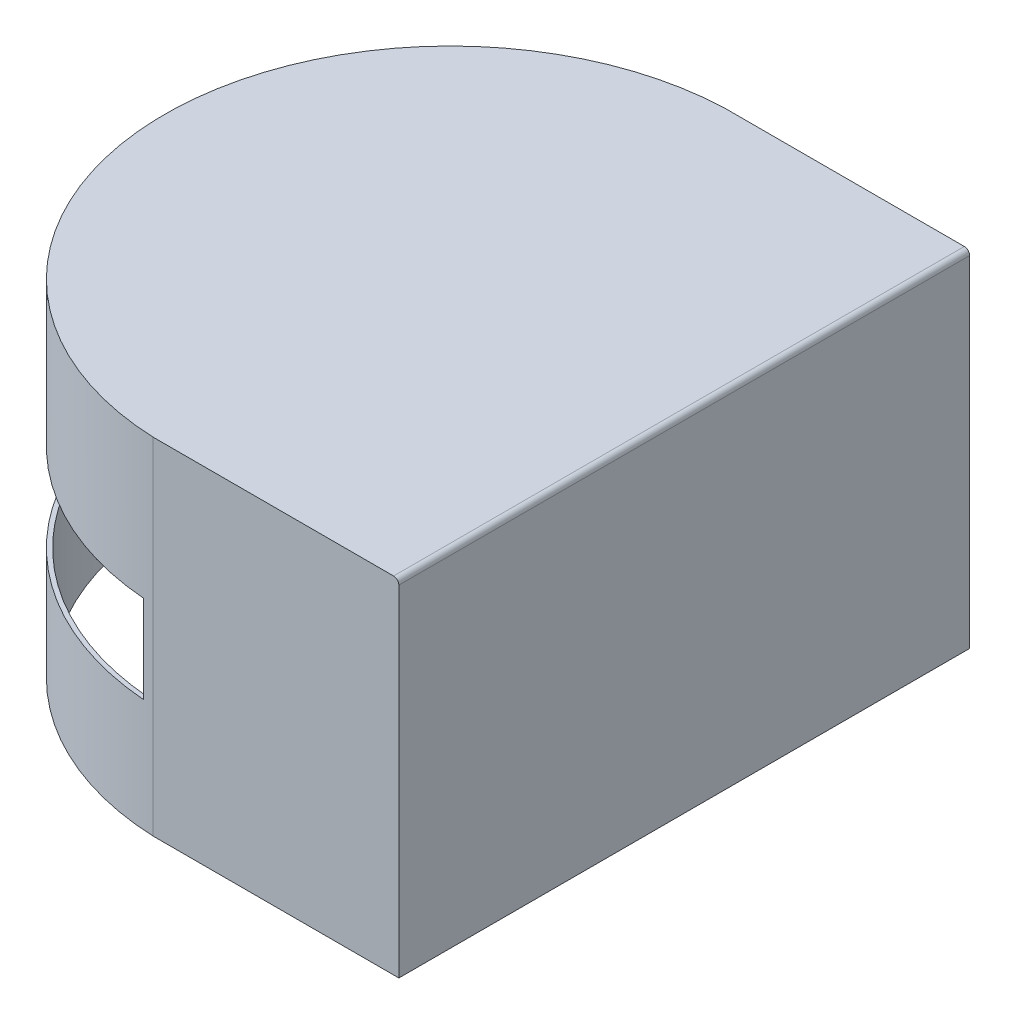
ISO-10303-21;
HEADER;
FILE_DESCRIPTION(('STEP AP214'),'2;1');
FILE_NAME('part.step','',(''),(''),'','','');
FILE_SCHEMA(('AUTOMOTIVE_DESIGN { 1 0 10303 214 1 1 1 1 }'));
ENDSEC;
DATA;
#1=APPLICATION_CONTEXT('core data for automotive mechanical design processes');
#2=APPLICATION_PROTOCOL_DEFINITION('international standard','automotive_design',2000,#1);
#3=PRODUCT_CONTEXT('',#1,'mechanical');
#4=PRODUCT('Part','Part','',(#3));
#5=PRODUCT_RELATED_PRODUCT_CATEGORY('part','',(#4));
#6=PRODUCT_DEFINITION_FORMATION('','',#4);
#7=PRODUCT_DEFINITION_CONTEXT('part definition',#1,'design');
#8=PRODUCT_DEFINITION('design','',#6,#7);
#9=PRODUCT_DEFINITION_SHAPE('','',#8);
#10=(LENGTH_UNIT() NAMED_UNIT(*) SI_UNIT(.MILLI.,.METRE.));
#11=(NAMED_UNIT(*) PLANE_ANGLE_UNIT() SI_UNIT($,.RADIAN.));
#12=(NAMED_UNIT(*) SI_UNIT($,.STERADIAN.) SOLID_ANGLE_UNIT());
#13=UNCERTAINTY_MEASURE_WITH_UNIT(LENGTH_MEASURE(1.E-05),#10,'distance_accuracy_value','');
#14=(GEOMETRIC_REPRESENTATION_CONTEXT(3) GLOBAL_UNCERTAINTY_ASSIGNED_CONTEXT((#13)) GLOBAL_UNIT_ASSIGNED_CONTEXT((#10,
#11,#12)) REPRESENTATION_CONTEXT('',''));
#15=CARTESIAN_POINT('',(0.,0.,0.));
#16=DIRECTION('',(0.,0.,1.));
#17=DIRECTION('',(1.,0.,0.));
#18=AXIS2_PLACEMENT_3D('',#15,#16,#17);
#19=CARTESIAN_POINT('',(3.35890771430427,-0.5,0.));
#20=DIRECTION('',(0.,1.,0.));
#21=DIRECTION('',(0.,0.,1.));
#22=AXIS2_PLACEMENT_3D('',#19,#20,#21);
#23=CYLINDRICAL_SURFACE('',#22,32.528397288769);
#24=CARTESIAN_POINT('',(3.35890771430427,-26.5000000000001,0.));
#25=DIRECTION('',(0.,-1.,0.));
#26=DIRECTION('',(1.,0.,0.));
#27=AXIS2_PLACEMENT_3D('',#24,#25,#26);
#28=CIRCLE('',#27,32.528397288769);
#29=CARTESIAN_POINT('',(0.830510425535308,-26.5000000000001,-32.4299836158784));
#30=VERTEX_POINT('',#29);
#31=CARTESIAN_POINT('',(0.830510425535322,-26.5000000000001,32.4299836158784));
#32=VERTEX_POINT('',#31);
#33=EDGE_CURVE('E182',#30,#32,#28,.F.);
#34=ORIENTED_EDGE('',*,*,#33,.F.);
#35=DIRECTION('',(0.,1.,0.));
#36=VECTOR('',#35,1.);
#37=CARTESIAN_POINT('',(0.830510425535308,-0.5,-32.4299836158784));
#38=LINE('',#37,#36);
#39=CARTESIAN_POINT('',(0.830510425535308,-16.5000000000001,-32.4299836158784));
#40=VERTEX_POINT('',#39);
#41=EDGE_CURVE('E172',#30,#40,#38,.T.);
#42=ORIENTED_EDGE('',*,*,#41,.T.);
#43=CARTESIAN_POINT('',(3.35890771430427,-16.5000000000001,0.));
#44=DIRECTION('',(0.,1.,0.));
#45=DIRECTION('',(-1.,0.,0.));
#46=AXIS2_PLACEMENT_3D('',#43,#44,#45);
#47=CIRCLE('',#46,32.528397288769);
#48=CARTESIAN_POINT('',(0.830510425535322,-16.5000000000001,32.4299836158784));
#49=VERTEX_POINT('',#48);
#50=EDGE_CURVE('E74',#49,#40,#47,.F.);
#51=ORIENTED_EDGE('',*,*,#50,.F.);
#52=DIRECTION('',(0.,1.,0.));
#53=VECTOR('',#52,1.);
#54=CARTESIAN_POINT('',(0.830510425535322,-0.5,32.4299836158784));
#55=LINE('',#54,#53);
#56=EDGE_CURVE('E177',#49,#32,#55,.F.);
#57=ORIENTED_EDGE('',*,*,#56,.T.);
#58=EDGE_LOOP('',(#34,#42,#51,#57));
#59=FACE_BOUND('',#58,.T.);
#60=DIRECTION('',(0.,-1.,0.));
#61=VECTOR('',#60,1.);
#62=CARTESIAN_POINT('',(1.99999999999999,-0.5,-32.5));
#63=LINE('',#62,#61);
#64=CARTESIAN_POINT('',(1.99999999999999,-39.35,-32.5));
#65=VERTEX_POINT('',#64);
#66=CARTESIAN_POINT('',(1.99999999999999,0.,-32.5));
#67=VERTEX_POINT('',#66);
#68=EDGE_CURVE('E277',#65,#67,#63,.F.);
#69=ORIENTED_EDGE('',*,*,#68,.F.);
#70=CARTESIAN_POINT('',(3.35890771430428,-39.35,0.));
#71=DIRECTION('',(0.,-1.,0.));
#72=DIRECTION('',(0.,0.,-1.));
#73=AXIS2_PLACEMENT_3D('',#70,#71,#72);
#74=CIRCLE('',#73,32.528397288769);
#75=CARTESIAN_POINT('',(2.00000000000001,-39.35,32.5));
#76=VERTEX_POINT('',#75);
#77=EDGE_CURVE('E207',#76,#65,#74,.T.);
#78=ORIENTED_EDGE('',*,*,#77,.F.);
#79=DIRECTION('',(0.,-1.,0.));
#80=VECTOR('',#79,1.);
#81=CARTESIAN_POINT('',(2.00000000000001,-0.5,32.5));
#82=LINE('',#81,#80);
#83=CARTESIAN_POINT('',(2.00000000000001,0.,32.5));
#84=VERTEX_POINT('',#83);
#85=EDGE_CURVE('E276',#76,#84,#82,.F.);
#86=ORIENTED_EDGE('',*,*,#85,.T.);
#87=CARTESIAN_POINT('',(3.35890771430427,0.,0.));
#88=DIRECTION('',(0.,1.,0.));
#89=DIRECTION('',(0.,0.,1.));
#90=AXIS2_PLACEMENT_3D('',#87,#88,#89);
#91=CIRCLE('',#90,32.528397288769);
#92=EDGE_CURVE('E271',#67,#84,#91,.T.);
#93=ORIENTED_EDGE('',*,*,#92,.F.);
#94=EDGE_LOOP('',(#69,#78,#86,#93));
#95=FACE_BOUND('',#94,.T.);
#96=ADVANCED_FACE('F59',(#59,#95),#23,.T.);
#97=CARTESIAN_POINT('',(3.35890771430428,-39.35,0.));
#98=DIRECTION('',(0.,1.,0.));
#99=DIRECTION('',(0.,0.,1.));
#100=AXIS2_PLACEMENT_3D('',#97,#98,#99);
#101=CYLINDRICAL_SURFACE('',#100,32.028397288769);
#102=CARTESIAN_POINT('',(3.35890771430428,-0.5,0.));
#103=DIRECTION('',(0.,-1.,0.));
#104=DIRECTION('',(1.,0.,0.));
#105=AXIS2_PLACEMENT_3D('',#102,#103,#104);
#106=CIRCLE('',#105,32.028397288769);
#107=CARTESIAN_POINT('',(2.01048905260203,-0.5,32.));
#108=VERTEX_POINT('',#107);
#109=CARTESIAN_POINT('',(2.01048905260203,-0.5,-32.));
#110=VERTEX_POINT('',#109);
#111=EDGE_CURVE('E192',#108,#110,#106,.T.);
#112=ORIENTED_EDGE('',*,*,#111,.F.);
#113=DIRECTION('',(0.,1.,0.));
#114=VECTOR('',#113,1.);
#115=CARTESIAN_POINT('',(2.01048905260203,-39.35,32.));
#116=LINE('',#115,#114);
#117=CARTESIAN_POINT('',(2.01048905260203,-39.35,32.));
#118=VERTEX_POINT('',#117);
#119=EDGE_CURVE('E214',#118,#108,#116,.T.);
#120=ORIENTED_EDGE('',*,*,#119,.F.);
#121=CARTESIAN_POINT('',(3.35890771430428,-39.35,0.));
#122=DIRECTION('',(0.,-1.,0.));
#123=DIRECTION('',(1.,0.,0.));
#124=AXIS2_PLACEMENT_3D('',#121,#122,#123);
#125=CIRCLE('',#124,32.028397288769);
#126=CARTESIAN_POINT('',(2.01048905260203,-39.35,-32.));
#127=VERTEX_POINT('',#126);
#128=EDGE_CURVE('E200',#118,#127,#125,.T.);
#129=ORIENTED_EDGE('',*,*,#128,.T.);
#130=DIRECTION('',(0.,1.,0.));
#131=VECTOR('',#130,1.);
#132=CARTESIAN_POINT('',(2.01048905260203,-39.35,-32.));
#133=LINE('',#132,#131);
#134=EDGE_CURVE('E217',#127,#110,#133,.T.);
#135=ORIENTED_EDGE('',*,*,#134,.T.);
#136=EDGE_LOOP('',(#112,#120,#129,#135));
#137=FACE_BOUND('',#136,.T.);
#138=CARTESIAN_POINT('',(3.35890771430428,-26.5000000000001,0.));
#139=DIRECTION('',(0.,-1.,0.));
#140=DIRECTION('',(1.,0.,0.));
#141=AXIS2_PLACEMENT_3D('',#138,#139,#140);
#142=CIRCLE('',#141,32.028397288769);
#143=CARTESIAN_POINT('',(0.830510425535322,-26.5000000000001,31.9284424931341));
#144=VERTEX_POINT('',#143);
#145=CARTESIAN_POINT('',(0.830510425535308,-26.5000000000001,-31.9284424931341));
#146=VERTEX_POINT('',#145);
#147=EDGE_CURVE('E67',#144,#146,#142,.T.);
#148=ORIENTED_EDGE('',*,*,#147,.F.);
#149=DIRECTION('',(0.,1.,0.));
#150=VECTOR('',#149,1.);
#151=CARTESIAN_POINT('',(0.830510425535322,-39.35,31.9284424931341));
#152=LINE('',#151,#150);
#153=CARTESIAN_POINT('',(0.830510425535322,-16.5000000000001,31.9284424931341));
#154=VERTEX_POINT('',#153);
#155=EDGE_CURVE('E13',#144,#154,#152,.T.);
#156=ORIENTED_EDGE('',*,*,#155,.T.);
#157=CARTESIAN_POINT('',(3.35890771430428,-16.5000000000001,0.));
#158=DIRECTION('',(0.,1.,0.));
#159=DIRECTION('',(-1.,0.,0.));
#160=AXIS2_PLACEMENT_3D('',#157,#158,#159);
#161=CIRCLE('',#160,32.028397288769);
#162=CARTESIAN_POINT('',(0.830510425535308,-16.5000000000001,-31.9284424931341));
#163=VERTEX_POINT('',#162);
#164=EDGE_CURVE('E288',#163,#154,#161,.T.);
#165=ORIENTED_EDGE('',*,*,#164,.F.);
#166=DIRECTION('',(0.,1.,0.));
#167=VECTOR('',#166,1.);
#168=CARTESIAN_POINT('',(0.830510425535308,-39.35,-31.9284424931341));
#169=LINE('',#168,#167);
#170=EDGE_CURVE('E286',#163,#146,#169,.F.);
#171=ORIENTED_EDGE('',*,*,#170,.T.);
#172=EDGE_LOOP('',(#148,#156,#165,#171));
#173=FACE_BOUND('',#172,.T.);
#174=ADVANCED_FACE('F297',(#137,#173),#101,.F.);
#175=CARTESIAN_POINT('',(-30.,-0.5,32.5));
#176=DIRECTION('',(0.,0.,1.));
#177=DIRECTION('',(1.,0.,0.));
#178=AXIS2_PLACEMENT_3D('',#175,#176,#177);
#179=PLANE('',#178);
#180=DIRECTION('',(1.,0.,0.));
#181=VECTOR('',#180,1.);
#182=CARTESIAN_POINT('',(-30.,0.,32.5));
#183=LINE('',#182,#181);
#184=CARTESIAN_POINT('',(29.4,0.,32.5));
#185=VERTEX_POINT('',#184);
#186=EDGE_CURVE('E283',#84,#185,#183,.T.);
#187=ORIENTED_EDGE('',*,*,#186,.F.);
#188=ORIENTED_EDGE('',*,*,#85,.F.);
#189=DIRECTION('',(-1.,0.,0.));
#190=VECTOR('',#189,1.);
#191=CARTESIAN_POINT('',(30.0000000000001,-39.35,32.5));
#192=LINE('',#191,#190);
#193=CARTESIAN_POINT('',(30.0000000000001,-39.35,32.5));
#194=VERTEX_POINT('',#193);
#195=EDGE_CURVE('E228',#194,#76,#192,.T.);
#196=ORIENTED_EDGE('',*,*,#195,.F.);
#197=DIRECTION('',(0.,1.,0.));
#198=VECTOR('',#197,1.);
#199=CARTESIAN_POINT('',(30.,-0.499999999999998,32.5));
#200=LINE('',#199,#198);
#201=CARTESIAN_POINT('',(30.,-0.600000000000002,32.5));
#202=VERTEX_POINT('',#201);
#203=EDGE_CURVE('E235',#194,#202,#200,.T.);
#204=ORIENTED_EDGE('',*,*,#203,.T.);
#205=CARTESIAN_POINT('',(29.4,-0.600000000000002,32.5));
#206=DIRECTION('',(0.,0.,1.));
#207=DIRECTION('',(1.,0.,0.));
#208=AXIS2_PLACEMENT_3D('',#205,#206,#207);
#209=CIRCLE('',#208,0.599999999999992);
#210=EDGE_CURVE('E260',#202,#185,#209,.T.);
#211=ORIENTED_EDGE('',*,*,#210,.T.);
#212=EDGE_LOOP('',(#187,#188,#196,#204,#211));
#213=FACE_BOUND('',#212,.T.);
#214=ADVANCED_FACE('F299',(#213),#179,.T.);
#215=CARTESIAN_POINT('',(0.,-0.5,0.));
#216=DIRECTION('',(0.,1.,0.));
#217=DIRECTION('',(0.,0.,1.));
#218=AXIS2_PLACEMENT_3D('',#215,#216,#217);
#219=PLANE('',#218);
#220=ORIENTED_EDGE('',*,*,#111,.T.);
#221=DIRECTION('',(1.,0.,0.));
#222=VECTOR('',#221,1.);
#223=CARTESIAN_POINT('',(1.99999999999999,-0.5,-32.));
#224=LINE('',#223,#222);
#225=CARTESIAN_POINT('',(29.4,-0.500000000000009,-32.));
#226=VERTEX_POINT('',#225);
#227=EDGE_CURVE('E190',#110,#226,#224,.T.);
#228=ORIENTED_EDGE('',*,*,#227,.T.);
#229=DIRECTION('',(0.,0.,1.));
#230=VECTOR('',#229,1.);
#231=CARTESIAN_POINT('',(29.4,-0.500000000000009,32.5));
#232=LINE('',#231,#230);
#233=CARTESIAN_POINT('',(29.4,-0.500000000000009,32.));
#234=VERTEX_POINT('',#233);
#235=EDGE_CURVE('E231',#234,#226,#232,.F.);
#236=ORIENTED_EDGE('',*,*,#235,.F.);
#237=DIRECTION('',(1.,0.,0.));
#238=VECTOR('',#237,1.);
#239=CARTESIAN_POINT('',(29.5000000000001,-0.5,32.));
#240=LINE('',#239,#238);
#241=EDGE_CURVE('E201',#234,#108,#240,.F.);
#242=ORIENTED_EDGE('',*,*,#241,.T.);
#243=EDGE_LOOP('',(#220,#228,#236,#242));
#244=FACE_BOUND('',#243,.T.);
#245=ADVANCED_FACE('F307',(#244),#219,.F.);
#246=CARTESIAN_POINT('',(0.,0.,0.));
#247=DIRECTION('',(0.,1.,0.));
#248=DIRECTION('',(0.,0.,1.));
#249=AXIS2_PLACEMENT_3D('',#246,#247,#248);
#250=PLANE('',#249);
#251=ORIENTED_EDGE('',*,*,#186,.T.);
#252=DIRECTION('',(0.,0.,1.));
#253=VECTOR('',#252,1.);
#254=CARTESIAN_POINT('',(29.4,0.,32.5));
#255=LINE('',#254,#253);
#256=CARTESIAN_POINT('',(29.4,0.,-32.5));
#257=VERTEX_POINT('',#256);
#258=EDGE_CURVE('E256',#185,#257,#255,.F.);
#259=ORIENTED_EDGE('',*,*,#258,.T.);
#260=DIRECTION('',(-1.,0.,0.));
#261=VECTOR('',#260,1.);
#262=CARTESIAN_POINT('',(-30.,0.,-32.5));
#263=LINE('',#262,#261);
#264=EDGE_CURVE('E280',#257,#67,#263,.T.);
#265=ORIENTED_EDGE('',*,*,#264,.T.);
#266=ORIENTED_EDGE('',*,*,#92,.T.);
#267=EDGE_LOOP('',(#251,#259,#265,#266));
#268=FACE_BOUND('',#267,.T.);
#269=ADVANCED_FACE('F341',(#268),#250,.T.);
#270=CARTESIAN_POINT('',(-30.,-0.5,-32.5));
#271=DIRECTION('',(0.,0.,-1.));
#272=DIRECTION('',(-1.,0.,0.));
#273=AXIS2_PLACEMENT_3D('',#270,#271,#272);
#274=PLANE('',#273);
#275=DIRECTION('',(0.,-1.,0.));
#276=VECTOR('',#275,1.);
#277=CARTESIAN_POINT('',(30.0000000000001,-39.35,-32.5));
#278=LINE('',#277,#276);
#279=CARTESIAN_POINT('',(30.,-0.6,-32.5));
#280=VERTEX_POINT('',#279);
#281=CARTESIAN_POINT('',(30.0000000000001,-39.35,-32.5));
#282=VERTEX_POINT('',#281);
#283=EDGE_CURVE('E241',#280,#282,#278,.T.);
#284=ORIENTED_EDGE('',*,*,#283,.T.);
#285=DIRECTION('',(-1.,0.,0.));
#286=VECTOR('',#285,1.);
#287=CARTESIAN_POINT('',(30.0000000000001,-39.35,-32.5));
#288=LINE('',#287,#286);
#289=EDGE_CURVE('E232',#282,#65,#288,.T.);
#290=ORIENTED_EDGE('',*,*,#289,.T.);
#291=ORIENTED_EDGE('',*,*,#68,.T.);
#292=ORIENTED_EDGE('',*,*,#264,.F.);
#293=CARTESIAN_POINT('',(29.4,-0.600000000000002,-32.5));
#294=DIRECTION('',(0.,0.,1.));
#295=DIRECTION('',(1.,0.,0.));
#296=AXIS2_PLACEMENT_3D('',#293,#294,#295);
#297=CIRCLE('',#296,0.599999999999992);
#298=EDGE_CURVE('E259',#257,#280,#297,.F.);
#299=ORIENTED_EDGE('',*,*,#298,.T.);
#300=EDGE_LOOP('',(#284,#290,#291,#292,#299));
#301=FACE_BOUND('',#300,.T.);
#302=ADVANCED_FACE('F61',(#301),#274,.T.);
#303=CARTESIAN_POINT('',(29.4,-0.600000000000002,32.5));
#304=DIRECTION('',(0.,0.,1.));
#305=DIRECTION('',(1.,0.,0.));
#306=AXIS2_PLACEMENT_3D('',#303,#304,#305);
#307=CYLINDRICAL_SURFACE('',#306,0.599999999999992);
#308=ORIENTED_EDGE('',*,*,#258,.F.);
#309=ORIENTED_EDGE('',*,*,#210,.F.);
#310=DIRECTION('',(0.,0.,1.));
#311=VECTOR('',#310,1.);
#312=CARTESIAN_POINT('',(30.,-0.6,0.));
#313=LINE('',#312,#311);
#314=EDGE_CURVE('E245',#280,#202,#313,.T.);
#315=ORIENTED_EDGE('',*,*,#314,.F.);
#316=ORIENTED_EDGE('',*,*,#298,.F.);
#317=EDGE_LOOP('',(#308,#309,#315,#316));
#318=FACE_BOUND('',#317,.T.);
#319=ADVANCED_FACE('F332',(#318),#307,.T.);
#320=CARTESIAN_POINT('',(29.4,-0.600000000000002,32.5));
#321=DIRECTION('',(0.,0.,1.));
#322=DIRECTION('',(1.,0.,0.));
#323=AXIS2_PLACEMENT_3D('',#320,#321,#322);
#324=CYLINDRICAL_SURFACE('',#323,0.0999999999999925);
#325=ORIENTED_EDGE('',*,*,#235,.T.);
#326=CARTESIAN_POINT('',(29.4,-0.600000000000002,-32.));
#327=DIRECTION('',(0.,0.,1.));
#328=DIRECTION('',(1.,0.,0.));
#329=AXIS2_PLACEMENT_3D('',#326,#327,#328);
#330=CIRCLE('',#329,0.0999999999999925);
#331=CARTESIAN_POINT('',(29.5,-0.6,-32.));
#332=VERTEX_POINT('',#331);
#333=EDGE_CURVE('E225',#226,#332,#330,.F.);
#334=ORIENTED_EDGE('',*,*,#333,.T.);
#335=DIRECTION('',(0.,0.,-1.));
#336=VECTOR('',#335,1.);
#337=CARTESIAN_POINT('',(29.5,-0.6,-32.5));
#338=LINE('',#337,#336);
#339=CARTESIAN_POINT('',(29.5,-0.600000000000003,32.));
#340=VERTEX_POINT('',#339);
#341=EDGE_CURVE('E251',#332,#340,#338,.F.);
#342=ORIENTED_EDGE('',*,*,#341,.T.);
#343=CARTESIAN_POINT('',(29.4,-0.600000000000002,32.));
#344=DIRECTION('',(0.,0.,-1.));
#345=DIRECTION('',(-1.,0.,0.));
#346=AXIS2_PLACEMENT_3D('',#343,#344,#345);
#347=CIRCLE('',#346,0.0999999999999925);
#348=EDGE_CURVE('E223',#340,#234,#347,.F.);
#349=ORIENTED_EDGE('',*,*,#348,.T.);
#350=EDGE_LOOP('',(#325,#334,#342,#349));
#351=FACE_BOUND('',#350,.T.);
#352=ADVANCED_FACE('F324',(#351),#324,.F.);
#353=CARTESIAN_POINT('',(30.,1.06231015670341E-13,0.));
#354=DIRECTION('',(1.,0.,0.));
#355=DIRECTION('',(0.,1.,0.));
#356=AXIS2_PLACEMENT_3D('',#353,#354,#355);
#357=PLANE('',#356);
#358=ORIENTED_EDGE('',*,*,#283,.F.);
#359=ORIENTED_EDGE('',*,*,#314,.T.);
#360=ORIENTED_EDGE('',*,*,#203,.F.);
#361=DIRECTION('',(0.,0.,1.));
#362=VECTOR('',#361,1.);
#363=CARTESIAN_POINT('',(30.0000000000001,-39.35,32.5));
#364=LINE('',#363,#362);
#365=EDGE_CURVE('E238',#282,#194,#364,.T.);
#366=ORIENTED_EDGE('',*,*,#365,.F.);
#367=EDGE_LOOP('',(#358,#359,#360,#366));
#368=FACE_BOUND('',#367,.T.);
#369=ADVANCED_FACE('F320',(#368),#357,.T.);
#370=CARTESIAN_POINT('',(29.5,1.0448527500092E-13,0.));
#371=DIRECTION('',(1.,0.,0.));
#372=DIRECTION('',(0.,1.,0.));
#373=AXIS2_PLACEMENT_3D('',#370,#371,#372);
#374=PLANE('',#373);
#375=ORIENTED_EDGE('',*,*,#341,.F.);
#376=DIRECTION('',(0.,1.,0.));
#377=VECTOR('',#376,1.);
#378=CARTESIAN_POINT('',(29.5000000000001,-39.35,-32.));
#379=LINE('',#378,#377);
#380=CARTESIAN_POINT('',(29.5000000000001,-39.35,-32.));
#381=VERTEX_POINT('',#380);
#382=EDGE_CURVE('E220',#381,#332,#379,.T.);
#383=ORIENTED_EDGE('',*,*,#382,.F.);
#384=DIRECTION('',(0.,0.,-1.));
#385=VECTOR('',#384,1.);
#386=CARTESIAN_POINT('',(29.5000000000001,-39.35,0.));
#387=LINE('',#386,#385);
#388=CARTESIAN_POINT('',(29.5000000000001,-39.35,32.));
#389=VERTEX_POINT('',#388);
#390=EDGE_CURVE('E243',#381,#389,#387,.F.);
#391=ORIENTED_EDGE('',*,*,#390,.T.);
#392=DIRECTION('',(0.,1.,0.));
#393=VECTOR('',#392,1.);
#394=CARTESIAN_POINT('',(29.5000000000001,-39.35,32.));
#395=LINE('',#394,#393);
#396=EDGE_CURVE('E209',#389,#340,#395,.T.);
#397=ORIENTED_EDGE('',*,*,#396,.T.);
#398=EDGE_LOOP('',(#375,#383,#391,#397));
#399=FACE_BOUND('',#398,.T.);
#400=ADVANCED_FACE('F323',(#399),#374,.F.);
#401=CARTESIAN_POINT('',(30.0000000000001,-39.35,32.5));
#402=DIRECTION('',(0.,-1.,0.));
#403=DIRECTION('',(1.,0.,0.));
#404=AXIS2_PLACEMENT_3D('',#401,#402,#403);
#405=PLANE('',#404);
#406=ORIENTED_EDGE('',*,*,#390,.F.);
#407=DIRECTION('',(1.,0.,0.));
#408=VECTOR('',#407,1.);
#409=CARTESIAN_POINT('',(1.99999999999999,-39.35,-32.));
#410=LINE('',#409,#408);
#411=EDGE_CURVE('E197',#127,#381,#410,.T.);
#412=ORIENTED_EDGE('',*,*,#411,.F.);
#413=ORIENTED_EDGE('',*,*,#128,.F.);
#414=DIRECTION('',(1.,0.,0.));
#415=VECTOR('',#414,1.);
#416=CARTESIAN_POINT('',(29.5000000000001,-39.35,32.));
#417=LINE('',#416,#415);
#418=EDGE_CURVE('E204',#389,#118,#417,.F.);
#419=ORIENTED_EDGE('',*,*,#418,.F.);
#420=EDGE_LOOP('',(#406,#412,#413,#419));
#421=FACE_BOUND('',#420,.T.);
#422=ORIENTED_EDGE('',*,*,#77,.T.);
#423=ORIENTED_EDGE('',*,*,#289,.F.);
#424=ORIENTED_EDGE('',*,*,#365,.T.);
#425=ORIENTED_EDGE('',*,*,#195,.T.);
#426=EDGE_LOOP('',(#422,#423,#424,#425));
#427=FACE_BOUND('',#426,.T.);
#428=ADVANCED_FACE('F318',(#421,#427),#405,.T.);
#429=CARTESIAN_POINT('',(1.99999999999999,-39.35,-32.));
#430=DIRECTION('',(0.,0.,1.));
#431=DIRECTION('',(1.,0.,0.));
#432=AXIS2_PLACEMENT_3D('',#429,#430,#431);
#433=PLANE('',#432);
#434=ORIENTED_EDGE('',*,*,#333,.F.);
#435=ORIENTED_EDGE('',*,*,#227,.F.);
#436=ORIENTED_EDGE('',*,*,#134,.F.);
#437=ORIENTED_EDGE('',*,*,#411,.T.);
#438=ORIENTED_EDGE('',*,*,#382,.T.);
#439=EDGE_LOOP('',(#434,#435,#436,#437,#438));
#440=FACE_BOUND('',#439,.T.);
#441=ADVANCED_FACE('F315',(#440),#433,.T.);
#442=CARTESIAN_POINT('',(29.5000000000001,-39.35,32.));
#443=DIRECTION('',(0.,0.,-1.));
#444=DIRECTION('',(-1.,0.,0.));
#445=AXIS2_PLACEMENT_3D('',#442,#443,#444);
#446=PLANE('',#445);
#447=ORIENTED_EDGE('',*,*,#348,.F.);
#448=ORIENTED_EDGE('',*,*,#396,.F.);
#449=ORIENTED_EDGE('',*,*,#418,.T.);
#450=ORIENTED_EDGE('',*,*,#119,.T.);
#451=ORIENTED_EDGE('',*,*,#241,.F.);
#452=EDGE_LOOP('',(#447,#448,#449,#450,#451));
#453=FACE_BOUND('',#452,.T.);
#454=ADVANCED_FACE('F313',(#453),#446,.T.);
#455=CARTESIAN_POINT('',(0.830510425535315,0.,0.));
#456=DIRECTION('',(-1.,0.,0.));
#457=DIRECTION('',(0.,0.,1.));
#458=AXIS2_PLACEMENT_3D('',#455,#456,#457);
#459=PLANE('',#458);
#460=DIRECTION('',(0.,0.,-1.));
#461=VECTOR('',#460,1.);
#462=CARTESIAN_POINT('',(0.830510425535308,-16.5000000000001,-32.5));
#463=LINE('',#462,#461);
#464=EDGE_CURVE('E292',#49,#154,#463,.T.);
#465=ORIENTED_EDGE('',*,*,#464,.T.);
#466=ORIENTED_EDGE('',*,*,#155,.F.);
#467=DIRECTION('',(0.,0.,1.));
#468=VECTOR('',#467,1.);
#469=CARTESIAN_POINT('',(0.830510425535308,-26.5000000000001,-32.5));
#470=LINE('',#469,#468);
#471=EDGE_CURVE('E186',#144,#32,#470,.T.);
#472=ORIENTED_EDGE('',*,*,#471,.T.);
#473=ORIENTED_EDGE('',*,*,#56,.F.);
#474=EDGE_LOOP('',(#465,#466,#472,#473));
#475=FACE_BOUND('',#474,.T.);
#476=ADVANCED_FACE('F295',(#475),#459,.T.);
#477=CARTESIAN_POINT('',(0.830510425535308,-26.5000000000001,-32.5));
#478=DIRECTION('',(0.,-1.,0.));
#479=DIRECTION('',(1.,0.,0.));
#480=AXIS2_PLACEMENT_3D('',#477,#478,#479);
#481=PLANE('',#480);
#482=ORIENTED_EDGE('',*,*,#33,.T.);
#483=ORIENTED_EDGE('',*,*,#471,.F.);
#484=ORIENTED_EDGE('',*,*,#147,.T.);
#485=EDGE_CURVE('E82',#30,#146,#470,.T.);
#486=ORIENTED_EDGE('',*,*,#485,.F.);
#487=EDGE_LOOP('',(#482,#483,#484,#486));
#488=FACE_BOUND('',#487,.T.);
#489=ADVANCED_FACE('F180',(#488),#481,.F.);
#490=CARTESIAN_POINT('',(0.830510425535308,-16.5000000000001,-32.5));
#491=DIRECTION('',(0.,1.,0.));
#492=DIRECTION('',(-1.,0.,0.));
#493=AXIS2_PLACEMENT_3D('',#490,#491,#492);
#494=PLANE('',#493);
#495=ORIENTED_EDGE('',*,*,#50,.T.);
#496=EDGE_CURVE('E174',#163,#40,#463,.T.);
#497=ORIENTED_EDGE('',*,*,#496,.F.);
#498=ORIENTED_EDGE('',*,*,#164,.T.);
#499=ORIENTED_EDGE('',*,*,#464,.F.);
#500=EDGE_LOOP('',(#495,#497,#498,#499));
#501=FACE_BOUND('',#500,.T.);
#502=ADVANCED_FACE('F291',(#501),#494,.F.);
#503=ORIENTED_EDGE('',*,*,#485,.T.);
#504=ORIENTED_EDGE('',*,*,#170,.F.);
#505=ORIENTED_EDGE('',*,*,#496,.T.);
#506=ORIENTED_EDGE('',*,*,#41,.F.);
#507=EDGE_LOOP('',(#503,#504,#505,#506));
#508=FACE_BOUND('',#507,.T.);
#509=ADVANCED_FACE('F173',(#508),#459,.T.);
#510=CLOSED_SHELL('',(#96,#174,#214,#245,#269,#302,#319,#352,#369,#400,#428,#441,#454,#476,#489,
#502,#509));
#511=MANIFOLD_SOLID_BREP('B2',#510);
#512=ADVANCED_BREP_SHAPE_REPRESENTATION('',(#18,#511),#14);
#513=SHAPE_DEFINITION_REPRESENTATION(#9,#512);
ENDSEC;
END-ISO-10303-21;
